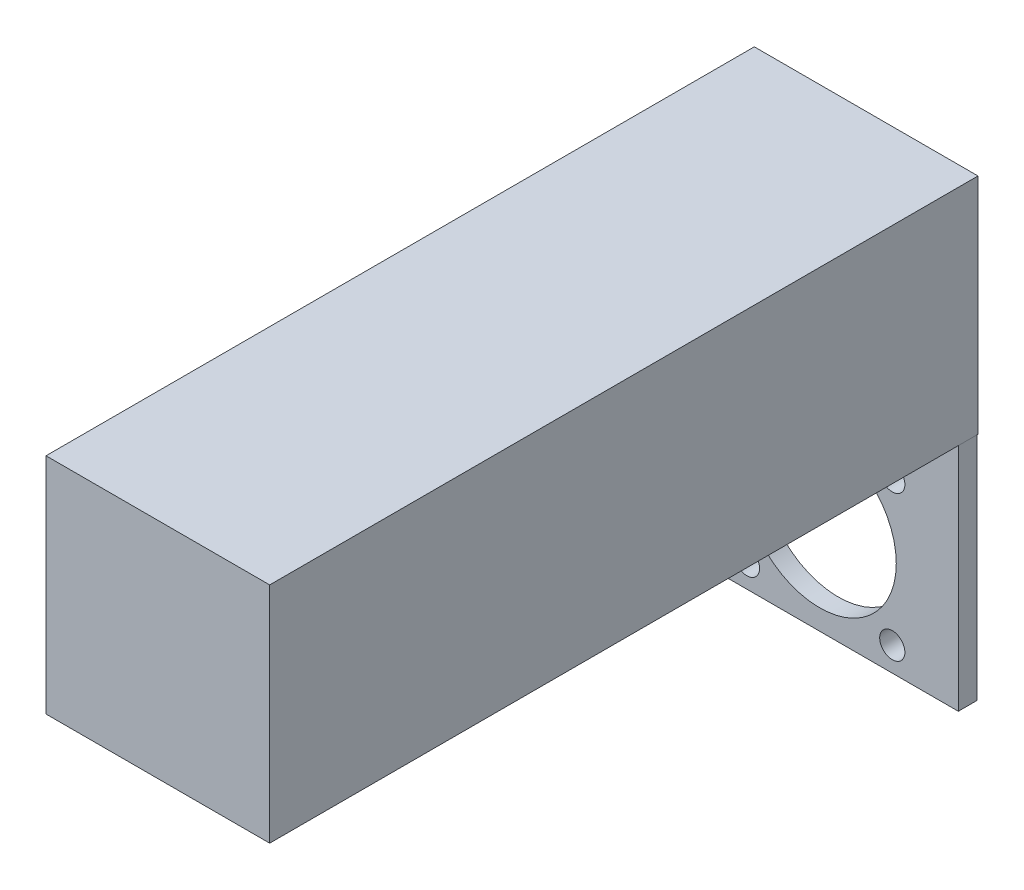
ISO-10303-21;
HEADER;
FILE_DESCRIPTION(('STEP AP214'),'2;1');
FILE_NAME('part.step','',(''),(''),'','','');
FILE_SCHEMA(('AUTOMOTIVE_DESIGN { 1 0 10303 214 1 1 1 1 }'));
ENDSEC;
DATA;
#1=APPLICATION_CONTEXT('core data for automotive mechanical design processes');
#2=APPLICATION_PROTOCOL_DEFINITION('international standard','automotive_design',2000,#1);
#3=PRODUCT_CONTEXT('',#1,'mechanical');
#4=PRODUCT('Part','Part','',(#3));
#5=PRODUCT_RELATED_PRODUCT_CATEGORY('part','',(#4));
#6=PRODUCT_DEFINITION_FORMATION('','',#4);
#7=PRODUCT_DEFINITION_CONTEXT('part definition',#1,'design');
#8=PRODUCT_DEFINITION('design','',#6,#7);
#9=PRODUCT_DEFINITION_SHAPE('','',#8);
#10=(LENGTH_UNIT() NAMED_UNIT(*) SI_UNIT(.MILLI.,.METRE.));
#11=(NAMED_UNIT(*) PLANE_ANGLE_UNIT() SI_UNIT($,.RADIAN.));
#12=(NAMED_UNIT(*) SI_UNIT($,.STERADIAN.) SOLID_ANGLE_UNIT());
#13=UNCERTAINTY_MEASURE_WITH_UNIT(LENGTH_MEASURE(1.E-05),#10,'distance_accuracy_value','');
#14=(GEOMETRIC_REPRESENTATION_CONTEXT(3) GLOBAL_UNCERTAINTY_ASSIGNED_CONTEXT((#13)) GLOBAL_UNIT_ASSIGNED_CONTEXT((#10,
#11,#12)) REPRESENTATION_CONTEXT('',''));
#15=CARTESIAN_POINT('',(0.,0.,0.));
#16=DIRECTION('',(0.,0.,1.));
#17=DIRECTION('',(1.,0.,0.));
#18=AXIS2_PLACEMENT_3D('',#15,#16,#17);
#19=CARTESIAN_POINT('',(0.,39.37,0.));
#20=DIRECTION('',(0.,0.,-1.));
#21=DIRECTION('',(-1.,0.,0.));
#22=AXIS2_PLACEMENT_3D('',#19,#20,#21);
#23=PLANE('',#22);
#24=CARTESIAN_POINT('',(0.,0.,0.));
#25=DIRECTION('',(0.,0.,1.));
#26=DIRECTION('',(1.,0.,0.));
#27=AXIS2_PLACEMENT_3D('',#24,#25,#26);
#28=CIRCLE('',#27,13.0556);
#29=CARTESIAN_POINT('',(13.0556,0.,0.));
#30=VERTEX_POINT('',#29);
#31=EDGE_CURVE('E133',#30,#30,#28,.F.);
#32=ORIENTED_EDGE('',*,*,#31,.T.);
#33=EDGE_LOOP('',(#32));
#34=FACE_BOUND('',#33,.T.);
#35=CARTESIAN_POINT('',(12.3747929348333,12.3747929348333,0.));
#36=DIRECTION('',(0.,0.,1.));
#37=DIRECTION('',(1.,0.,0.));
#38=AXIS2_PLACEMENT_3D('',#35,#36,#37);
#39=CIRCLE('',#38,2.1463);
#40=CARTESIAN_POINT('',(14.5210929348333,12.3747929348333,0.));
#41=VERTEX_POINT('',#40);
#42=EDGE_CURVE('E137',#41,#41,#39,.F.);
#43=ORIENTED_EDGE('',*,*,#42,.T.);
#44=EDGE_LOOP('',(#43));
#45=FACE_BOUND('',#44,.T.);
#46=CARTESIAN_POINT('',(12.3747929348332,-12.3747929348334,0.));
#47=DIRECTION('',(0.,0.,1.));
#48=DIRECTION('',(1.,0.,0.));
#49=AXIS2_PLACEMENT_3D('',#46,#47,#48);
#50=CIRCLE('',#49,2.1463);
#51=CARTESIAN_POINT('',(14.5210929348332,-12.3747929348334,0.));
#52=VERTEX_POINT('',#51);
#53=EDGE_CURVE('E140',#52,#52,#50,.F.);
#54=ORIENTED_EDGE('',*,*,#53,.T.);
#55=EDGE_LOOP('',(#54));
#56=FACE_BOUND('',#55,.T.);
#57=CARTESIAN_POINT('',(-12.3747929348334,-12.3747929348332,0.));
#58=DIRECTION('',(0.,0.,1.));
#59=DIRECTION('',(1.,0.,0.));
#60=AXIS2_PLACEMENT_3D('',#57,#58,#59);
#61=CIRCLE('',#60,2.1463);
#62=CARTESIAN_POINT('',(-10.2284929348334,-12.3747929348332,0.));
#63=VERTEX_POINT('',#62);
#64=EDGE_CURVE('E142',#63,#63,#61,.F.);
#65=ORIENTED_EDGE('',*,*,#64,.T.);
#66=EDGE_LOOP('',(#65));
#67=FACE_BOUND('',#66,.T.);
#68=CARTESIAN_POINT('',(-12.3747929348331,12.3747929348334,0.));
#69=DIRECTION('',(0.,0.,1.));
#70=DIRECTION('',(1.,0.,0.));
#71=AXIS2_PLACEMENT_3D('',#68,#69,#70);
#72=CIRCLE('',#71,2.1463);
#73=CARTESIAN_POINT('',(-10.2284929348331,12.3747929348334,0.));
#74=VERTEX_POINT('',#73);
#75=EDGE_CURVE('E19',#74,#74,#72,.F.);
#76=ORIENTED_EDGE('',*,*,#75,.T.);
#77=EDGE_LOOP('',(#76));
#78=FACE_BOUND('',#77,.T.);
#79=DIRECTION('',(0.,1.,0.));
#80=VECTOR('',#79,1.);
#81=CARTESIAN_POINT('',(23.622,-16.51,0.));
#82=LINE('',#81,#80);
#83=CARTESIAN_POINT('',(23.622,22.86,0.));
#84=VERTEX_POINT('',#83);
#85=CARTESIAN_POINT('',(23.622,-16.51,0.));
#86=VERTEX_POINT('',#85);
#87=EDGE_CURVE('E95',#84,#86,#82,.F.);
#88=ORIENTED_EDGE('',*,*,#87,.F.);
#89=DIRECTION('',(1.,0.,0.));
#90=VECTOR('',#89,1.);
#91=CARTESIAN_POINT('',(23.7998,22.86,0.));
#92=LINE('',#91,#90);
#93=CARTESIAN_POINT('',(-13.97,22.86,0.));
#94=VERTEX_POINT('',#93);
#95=EDGE_CURVE('E183',#94,#84,#92,.T.);
#96=ORIENTED_EDGE('',*,*,#95,.F.);
#97=DIRECTION('',(0.,1.,0.));
#98=VECTOR('',#97,1.);
#99=CARTESIAN_POINT('',(-13.97,19.05,0.));
#100=LINE('',#99,#98);
#101=CARTESIAN_POINT('',(-13.97,19.05,0.));
#102=VERTEX_POINT('',#101);
#103=EDGE_CURVE('E147',#102,#94,#100,.T.);
#104=ORIENTED_EDGE('',*,*,#103,.F.);
#105=DIRECTION('',(-1.,0.,0.));
#106=VECTOR('',#105,1.);
#107=CARTESIAN_POINT('',(-16.51,19.05,0.));
#108=LINE('',#107,#106);
#109=CARTESIAN_POINT('',(-16.51,19.05,0.));
#110=VERTEX_POINT('',#109);
#111=EDGE_CURVE('E155',#110,#102,#108,.F.);
#112=ORIENTED_EDGE('',*,*,#111,.F.);
#113=DIRECTION('',(0.,1.,0.));
#114=VECTOR('',#113,1.);
#115=CARTESIAN_POINT('',(-16.51,0.,0.));
#116=LINE('',#115,#114);
#117=CARTESIAN_POINT('',(-16.51,-16.51,0.));
#118=VERTEX_POINT('',#117);
#119=EDGE_CURVE('E90',#110,#118,#116,.F.);
#120=ORIENTED_EDGE('',*,*,#119,.T.);
#121=DIRECTION('',(1.,0.,0.));
#122=VECTOR('',#121,1.);
#123=CARTESIAN_POINT('',(0.,-16.51,0.));
#124=LINE('',#123,#122);
#125=EDGE_CURVE('E105',#86,#118,#124,.F.);
#126=ORIENTED_EDGE('',*,*,#125,.F.);
#127=EDGE_LOOP('',(#88,#96,#104,#112,#120,#126));
#128=FACE_BOUND('',#127,.T.);
#129=ADVANCED_FACE('F16',(#34,#45,#56,#67,#78,#128),#23,.F.);
#130=CARTESIAN_POINT('',(23.622,-16.51,0.));
#131=DIRECTION('',(1.,0.,0.));
#132=DIRECTION('',(0.,0.,-1.));
#133=AXIS2_PLACEMENT_3D('',#130,#131,#132);
#134=PLANE('',#133);
#135=ORIENTED_EDGE('',*,*,#87,.T.);
#136=DIRECTION('',(0.,0.,1.));
#137=VECTOR('',#136,1.);
#138=CARTESIAN_POINT('',(23.622,-16.51,0.));
#139=LINE('',#138,#137);
#140=CARTESIAN_POINT('',(23.622,-16.51,-3.175));
#141=VERTEX_POINT('',#140);
#142=EDGE_CURVE('E98',#141,#86,#139,.T.);
#143=ORIENTED_EDGE('',*,*,#142,.F.);
#144=DIRECTION('',(0.,1.,0.));
#145=VECTOR('',#144,1.);
#146=CARTESIAN_POINT('',(23.622,39.37,-3.175));
#147=LINE('',#146,#145);
#148=CARTESIAN_POINT('',(23.622,22.86,-3.175));
#149=VERTEX_POINT('',#148);
#150=EDGE_CURVE('E178',#149,#141,#147,.F.);
#151=ORIENTED_EDGE('',*,*,#150,.F.);
#152=DIRECTION('',(0.,0.,-1.));
#153=VECTOR('',#152,1.);
#154=CARTESIAN_POINT('',(23.622,22.86,117.475));
#155=LINE('',#154,#153);
#156=EDGE_CURVE('E101',#84,#149,#155,.T.);
#157=ORIENTED_EDGE('',*,*,#156,.F.);
#158=EDGE_LOOP('',(#135,#143,#151,#157));
#159=FACE_BOUND('',#158,.T.);
#160=ADVANCED_FACE('F96',(#159),#134,.T.);
#161=CARTESIAN_POINT('',(0.,-16.51,0.));
#162=DIRECTION('',(0.,-1.,0.));
#163=DIRECTION('',(1.,0.,0.));
#164=AXIS2_PLACEMENT_3D('',#161,#162,#163);
#165=PLANE('',#164);
#166=ORIENTED_EDGE('',*,*,#125,.T.);
#167=DIRECTION('',(0.,0.,1.));
#168=VECTOR('',#167,1.);
#169=CARTESIAN_POINT('',(-16.51,-16.51,0.));
#170=LINE('',#169,#168);
#171=CARTESIAN_POINT('',(-16.51,-16.51,-3.175));
#172=VERTEX_POINT('',#171);
#173=EDGE_CURVE('E164',#118,#172,#170,.F.);
#174=ORIENTED_EDGE('',*,*,#173,.T.);
#175=DIRECTION('',(-1.,0.,0.));
#176=VECTOR('',#175,1.);
#177=CARTESIAN_POINT('',(0.,-16.51,-3.175));
#178=LINE('',#177,#176);
#179=EDGE_CURVE('E111',#141,#172,#178,.T.);
#180=ORIENTED_EDGE('',*,*,#179,.F.);
#181=ORIENTED_EDGE('',*,*,#142,.T.);
#182=EDGE_LOOP('',(#166,#174,#180,#181));
#183=FACE_BOUND('',#182,.T.);
#184=ADVANCED_FACE('F109',(#183),#165,.T.);
#185=CARTESIAN_POINT('',(-16.51,0.,0.));
#186=DIRECTION('',(1.,0.,0.));
#187=DIRECTION('',(0.,1.,0.));
#188=AXIS2_PLACEMENT_3D('',#185,#186,#187);
#189=PLANE('',#188);
#190=ORIENTED_EDGE('',*,*,#173,.F.);
#191=ORIENTED_EDGE('',*,*,#119,.F.);
#192=DIRECTION('',(0.,0.,1.));
#193=VECTOR('',#192,1.);
#194=CARTESIAN_POINT('',(-16.51,19.05,0.));
#195=LINE('',#194,#193);
#196=CARTESIAN_POINT('',(-16.51,19.05,-3.175));
#197=VERTEX_POINT('',#196);
#198=EDGE_CURVE('E161',#197,#110,#195,.T.);
#199=ORIENTED_EDGE('',*,*,#198,.F.);
#200=DIRECTION('',(0.,1.,0.));
#201=VECTOR('',#200,1.);
#202=CARTESIAN_POINT('',(-16.51,39.37,-3.175));
#203=LINE('',#202,#201);
#204=EDGE_CURVE('E168',#172,#197,#203,.T.);
#205=ORIENTED_EDGE('',*,*,#204,.F.);
#206=EDGE_LOOP('',(#190,#191,#199,#205));
#207=FACE_BOUND('',#206,.T.);
#208=ADVANCED_FACE('F169',(#207),#189,.F.);
#209=CARTESIAN_POINT('',(-16.51,19.05,0.));
#210=DIRECTION('',(0.,1.,0.));
#211=DIRECTION('',(-1.,0.,0.));
#212=AXIS2_PLACEMENT_3D('',#209,#210,#211);
#213=PLANE('',#212);
#214=ORIENTED_EDGE('',*,*,#111,.T.);
#215=DIRECTION('',(0.,0.,1.));
#216=VECTOR('',#215,1.);
#217=CARTESIAN_POINT('',(-13.97,19.05,0.));
#218=LINE('',#217,#216);
#219=CARTESIAN_POINT('',(-13.97,19.05,-3.175));
#220=VERTEX_POINT('',#219);
#221=EDGE_CURVE('E150',#220,#102,#218,.T.);
#222=ORIENTED_EDGE('',*,*,#221,.F.);
#223=DIRECTION('',(-1.,0.,0.));
#224=VECTOR('',#223,1.);
#225=CARTESIAN_POINT('',(0.,19.05,-3.175));
#226=LINE('',#225,#224);
#227=EDGE_CURVE('E173',#197,#220,#226,.F.);
#228=ORIENTED_EDGE('',*,*,#227,.F.);
#229=ORIENTED_EDGE('',*,*,#198,.T.);
#230=EDGE_LOOP('',(#214,#222,#228,#229));
#231=FACE_BOUND('',#230,.T.);
#232=ADVANCED_FACE('F271',(#231),#213,.T.);
#233=CARTESIAN_POINT('',(-13.97,19.05,0.));
#234=DIRECTION('',(-1.,0.,0.));
#235=DIRECTION('',(0.,0.,1.));
#236=AXIS2_PLACEMENT_3D('',#233,#234,#235);
#237=PLANE('',#236);
#238=ORIENTED_EDGE('',*,*,#103,.T.);
#239=DIRECTION('',(0.,0.,-1.));
#240=VECTOR('',#239,1.);
#241=CARTESIAN_POINT('',(-13.97,22.86,117.475));
#242=LINE('',#241,#240);
#243=CARTESIAN_POINT('',(-13.97,22.86,-3.175));
#244=VERTEX_POINT('',#243);
#245=EDGE_CURVE('E136',#244,#94,#242,.F.);
#246=ORIENTED_EDGE('',*,*,#245,.F.);
#247=DIRECTION('',(0.,1.,0.));
#248=VECTOR('',#247,1.);
#249=CARTESIAN_POINT('',(-13.97,39.37,-3.175));
#250=LINE('',#249,#248);
#251=EDGE_CURVE('E193',#220,#244,#250,.T.);
#252=ORIENTED_EDGE('',*,*,#251,.F.);
#253=ORIENTED_EDGE('',*,*,#221,.T.);
#254=EDGE_LOOP('',(#238,#246,#252,#253));
#255=FACE_BOUND('',#254,.T.);
#256=ADVANCED_FACE('F192',(#255),#237,.T.);
#257=CARTESIAN_POINT('',(-12.3747929348331,12.3747929348334,-3.175));
#258=DIRECTION('',(0.,0.,1.));
#259=DIRECTION('',(1.,0.,0.));
#260=AXIS2_PLACEMENT_3D('',#257,#258,#259);
#261=CYLINDRICAL_SURFACE('',#260,2.1463);
#262=ORIENTED_EDGE('',*,*,#75,.F.);
#263=EDGE_LOOP('',(#262));
#264=FACE_BOUND('',#263,.T.);
#265=CARTESIAN_POINT('',(-12.3747929348331,12.3747929348334,-3.175));
#266=DIRECTION('',(0.,0.,1.));
#267=DIRECTION('',(1.,0.,0.));
#268=AXIS2_PLACEMENT_3D('',#265,#266,#267);
#269=CIRCLE('',#268,2.1463);
#270=CARTESIAN_POINT('',(-10.2284929348331,12.3747929348334,-3.175));
#271=VERTEX_POINT('',#270);
#272=EDGE_CURVE('E129',#271,#271,#269,.T.);
#273=ORIENTED_EDGE('',*,*,#272,.F.);
#274=EDGE_LOOP('',(#273));
#275=FACE_BOUND('',#274,.T.);
#276=ADVANCED_FACE('F264',(#264,#275),#261,.F.);
#277=CARTESIAN_POINT('',(-12.3747929348334,-12.3747929348332,-3.175));
#278=DIRECTION('',(0.,0.,1.));
#279=DIRECTION('',(1.,0.,0.));
#280=AXIS2_PLACEMENT_3D('',#277,#278,#279);
#281=CYLINDRICAL_SURFACE('',#280,2.1463);
#282=ORIENTED_EDGE('',*,*,#64,.F.);
#283=EDGE_LOOP('',(#282));
#284=FACE_BOUND('',#283,.T.);
#285=CARTESIAN_POINT('',(-12.3747929348334,-12.3747929348332,-3.175));
#286=DIRECTION('',(0.,0.,1.));
#287=DIRECTION('',(1.,0.,0.));
#288=AXIS2_PLACEMENT_3D('',#285,#286,#287);
#289=CIRCLE('',#288,2.1463);
#290=CARTESIAN_POINT('',(-10.2284929348334,-12.3747929348332,-3.175));
#291=VERTEX_POINT('',#290);
#292=EDGE_CURVE('E126',#291,#291,#289,.T.);
#293=ORIENTED_EDGE('',*,*,#292,.F.);
#294=EDGE_LOOP('',(#293));
#295=FACE_BOUND('',#294,.T.);
#296=ADVANCED_FACE('F260',(#284,#295),#281,.F.);
#297=CARTESIAN_POINT('',(12.3747929348332,-12.3747929348334,-3.175));
#298=DIRECTION('',(0.,0.,1.));
#299=DIRECTION('',(1.,0.,0.));
#300=AXIS2_PLACEMENT_3D('',#297,#298,#299);
#301=CYLINDRICAL_SURFACE('',#300,2.1463);
#302=ORIENTED_EDGE('',*,*,#53,.F.);
#303=EDGE_LOOP('',(#302));
#304=FACE_BOUND('',#303,.T.);
#305=CARTESIAN_POINT('',(12.3747929348332,-12.3747929348334,-3.175));
#306=DIRECTION('',(0.,0.,1.));
#307=DIRECTION('',(1.,0.,0.));
#308=AXIS2_PLACEMENT_3D('',#305,#306,#307);
#309=CIRCLE('',#308,2.1463);
#310=CARTESIAN_POINT('',(14.5210929348332,-12.3747929348334,-3.175));
#311=VERTEX_POINT('',#310);
#312=EDGE_CURVE('E123',#311,#311,#309,.T.);
#313=ORIENTED_EDGE('',*,*,#312,.F.);
#314=EDGE_LOOP('',(#313));
#315=FACE_BOUND('',#314,.T.);
#316=ADVANCED_FACE('F256',(#304,#315),#301,.F.);
#317=CARTESIAN_POINT('',(12.3747929348333,12.3747929348333,-3.175));
#318=DIRECTION('',(0.,0.,1.));
#319=DIRECTION('',(1.,0.,0.));
#320=AXIS2_PLACEMENT_3D('',#317,#318,#319);
#321=CYLINDRICAL_SURFACE('',#320,2.1463);
#322=ORIENTED_EDGE('',*,*,#42,.F.);
#323=EDGE_LOOP('',(#322));
#324=FACE_BOUND('',#323,.T.);
#325=CARTESIAN_POINT('',(12.3747929348333,12.3747929348333,-3.175));
#326=DIRECTION('',(0.,0.,1.));
#327=DIRECTION('',(1.,0.,0.));
#328=AXIS2_PLACEMENT_3D('',#325,#326,#327);
#329=CIRCLE('',#328,2.1463);
#330=CARTESIAN_POINT('',(14.5210929348333,12.3747929348333,-3.175));
#331=VERTEX_POINT('',#330);
#332=EDGE_CURVE('E120',#331,#331,#329,.T.);
#333=ORIENTED_EDGE('',*,*,#332,.F.);
#334=EDGE_LOOP('',(#333));
#335=FACE_BOUND('',#334,.T.);
#336=ADVANCED_FACE('F252',(#324,#335),#321,.F.);
#337=CARTESIAN_POINT('',(0.,0.,-3.175));
#338=DIRECTION('',(0.,0.,1.));
#339=DIRECTION('',(1.,0.,0.));
#340=AXIS2_PLACEMENT_3D('',#337,#338,#339);
#341=CYLINDRICAL_SURFACE('',#340,13.0556);
#342=ORIENTED_EDGE('',*,*,#31,.F.);
#343=EDGE_LOOP('',(#342));
#344=FACE_BOUND('',#343,.T.);
#345=CARTESIAN_POINT('',(0.,0.,-3.175));
#346=DIRECTION('',(0.,0.,1.));
#347=DIRECTION('',(1.,0.,0.));
#348=AXIS2_PLACEMENT_3D('',#345,#346,#347);
#349=CIRCLE('',#348,13.0556);
#350=CARTESIAN_POINT('',(13.0556,0.,-3.175));
#351=VERTEX_POINT('',#350);
#352=EDGE_CURVE('E116',#351,#351,#349,.T.);
#353=ORIENTED_EDGE('',*,*,#352,.F.);
#354=EDGE_LOOP('',(#353));
#355=FACE_BOUND('',#354,.T.);
#356=ADVANCED_FACE('F249',(#344,#355),#341,.F.);
#357=CARTESIAN_POINT('',(23.7998,22.86,117.475));
#358=DIRECTION('',(0.,-1.,0.));
#359=DIRECTION('',(0.,0.,-1.));
#360=AXIS2_PLACEMENT_3D('',#357,#358,#359);
#361=PLANE('',#360);
#362=DIRECTION('',(0.,0.,1.));
#363=VECTOR('',#362,1.);
#364=CARTESIAN_POINT('',(-14.3002,22.86,117.475));
#365=LINE('',#364,#363);
#366=CARTESIAN_POINT('',(-14.3002,22.86,-3.175));
#367=VERTEX_POINT('',#366);
#368=CARTESIAN_POINT('',(-14.3002,22.86,117.475));
#369=VERTEX_POINT('',#368);
#370=EDGE_CURVE('E201',#367,#369,#365,.T.);
#371=ORIENTED_EDGE('',*,*,#370,.F.);
#372=DIRECTION('',(-1.,0.,0.));
#373=VECTOR('',#372,1.);
#374=CARTESIAN_POINT('',(0.,22.86,-3.175));
#375=LINE('',#374,#373);
#376=EDGE_CURVE('E189',#244,#367,#375,.T.);
#377=ORIENTED_EDGE('',*,*,#376,.F.);
#378=ORIENTED_EDGE('',*,*,#245,.T.);
#379=ORIENTED_EDGE('',*,*,#95,.T.);
#380=ORIENTED_EDGE('',*,*,#156,.T.);
#381=DIRECTION('',(-1.,0.,0.));
#382=VECTOR('',#381,1.);
#383=CARTESIAN_POINT('',(0.,22.86,-3.175));
#384=LINE('',#383,#382);
#385=CARTESIAN_POINT('',(23.7998,22.86,-3.175));
#386=VERTEX_POINT('',#385);
#387=EDGE_CURVE('E132',#386,#149,#384,.T.);
#388=ORIENTED_EDGE('',*,*,#387,.F.);
#389=DIRECTION('',(0.,0.,-1.));
#390=VECTOR('',#389,1.);
#391=CARTESIAN_POINT('',(23.7998,22.86,117.475));
#392=LINE('',#391,#390);
#393=CARTESIAN_POINT('',(23.7998,22.86,117.475));
#394=VERTEX_POINT('',#393);
#395=EDGE_CURVE('E212',#394,#386,#392,.T.);
#396=ORIENTED_EDGE('',*,*,#395,.F.);
#397=DIRECTION('',(1.,0.,0.));
#398=VECTOR('',#397,1.);
#399=CARTESIAN_POINT('',(0.,22.86,117.475));
#400=LINE('',#399,#398);
#401=EDGE_CURVE('E206',#369,#394,#400,.T.);
#402=ORIENTED_EDGE('',*,*,#401,.F.);
#403=EDGE_LOOP('',(#371,#377,#378,#379,#380,#388,#396,#402));
#404=FACE_BOUND('',#403,.T.);
#405=ADVANCED_FACE('F188',(#404),#361,.T.);
#406=CARTESIAN_POINT('',(0.,39.37,-3.175));
#407=DIRECTION('',(0.,0.,-1.));
#408=DIRECTION('',(-1.,0.,0.));
#409=AXIS2_PLACEMENT_3D('',#406,#407,#408);
#410=PLANE('',#409);
#411=ORIENTED_EDGE('',*,*,#352,.T.);
#412=EDGE_LOOP('',(#411));
#413=FACE_BOUND('',#412,.T.);
#414=ORIENTED_EDGE('',*,*,#332,.T.);
#415=EDGE_LOOP('',(#414));
#416=FACE_BOUND('',#415,.T.);
#417=ORIENTED_EDGE('',*,*,#312,.T.);
#418=EDGE_LOOP('',(#417));
#419=FACE_BOUND('',#418,.T.);
#420=ORIENTED_EDGE('',*,*,#292,.T.);
#421=EDGE_LOOP('',(#420));
#422=FACE_BOUND('',#421,.T.);
#423=ORIENTED_EDGE('',*,*,#272,.T.);
#424=EDGE_LOOP('',(#423));
#425=FACE_BOUND('',#424,.T.);
#426=DIRECTION('',(0.,1.,0.));
#427=VECTOR('',#426,1.);
#428=CARTESIAN_POINT('',(23.7998,22.86,-3.175));
#429=LINE('',#428,#427);
#430=CARTESIAN_POINT('',(23.7998,60.96,-3.175));
#431=VERTEX_POINT('',#430);
#432=EDGE_CURVE('E208',#386,#431,#429,.T.);
#433=ORIENTED_EDGE('',*,*,#432,.F.);
#434=ORIENTED_EDGE('',*,*,#387,.T.);
#435=ORIENTED_EDGE('',*,*,#150,.T.);
#436=ORIENTED_EDGE('',*,*,#179,.T.);
#437=ORIENTED_EDGE('',*,*,#204,.T.);
#438=ORIENTED_EDGE('',*,*,#227,.T.);
#439=ORIENTED_EDGE('',*,*,#251,.T.);
#440=ORIENTED_EDGE('',*,*,#376,.T.);
#441=DIRECTION('',(0.,1.,0.));
#442=VECTOR('',#441,1.);
#443=CARTESIAN_POINT('',(-14.3002,22.86,-3.175));
#444=LINE('',#443,#442);
#445=CARTESIAN_POINT('',(-14.3002,60.96,-3.175));
#446=VERTEX_POINT('',#445);
#447=EDGE_CURVE('E119',#446,#367,#444,.F.);
#448=ORIENTED_EDGE('',*,*,#447,.F.);
#449=DIRECTION('',(-1.,0.,0.));
#450=VECTOR('',#449,1.);
#451=CARTESIAN_POINT('',(23.7998,60.96,-3.175));
#452=LINE('',#451,#450);
#453=EDGE_CURVE('E215',#431,#446,#452,.T.);
#454=ORIENTED_EDGE('',*,*,#453,.F.);
#455=EDGE_LOOP('',(#433,#434,#435,#436,#437,#438,#439,#440,#448,#454));
#456=FACE_BOUND('',#455,.T.);
#457=ADVANCED_FACE('F176',(#413,#416,#419,#422,#425,#456),#410,.T.);
#458=CARTESIAN_POINT('',(-14.3002,22.86,117.475));
#459=DIRECTION('',(-1.,0.,0.));
#460=DIRECTION('',(0.,0.,1.));
#461=AXIS2_PLACEMENT_3D('',#458,#459,#460);
#462=PLANE('',#461);
#463=DIRECTION('',(0.,1.,0.));
#464=VECTOR('',#463,1.);
#465=CARTESIAN_POINT('',(-14.3002,0.,117.475));
#466=LINE('',#465,#464);
#467=CARTESIAN_POINT('',(-14.3002,60.96,117.475));
#468=VERTEX_POINT('',#467);
#469=EDGE_CURVE('E203',#468,#369,#466,.F.);
#470=ORIENTED_EDGE('',*,*,#469,.F.);
#471=DIRECTION('',(0.,0.,1.));
#472=VECTOR('',#471,1.);
#473=CARTESIAN_POINT('',(-14.3002,60.96,117.475));
#474=LINE('',#473,#472);
#475=EDGE_CURVE('E218',#446,#468,#474,.T.);
#476=ORIENTED_EDGE('',*,*,#475,.F.);
#477=ORIENTED_EDGE('',*,*,#447,.T.);
#478=ORIENTED_EDGE('',*,*,#370,.T.);
#479=EDGE_LOOP('',(#470,#476,#477,#478));
#480=FACE_BOUND('',#479,.T.);
#481=ADVANCED_FACE('F229',(#480),#462,.T.);
#482=CARTESIAN_POINT('',(0.,0.,117.475));
#483=DIRECTION('',(0.,0.,1.));
#484=DIRECTION('',(1.,0.,0.));
#485=AXIS2_PLACEMENT_3D('',#482,#483,#484);
#486=PLANE('',#485);
#487=ORIENTED_EDGE('',*,*,#469,.T.);
#488=ORIENTED_EDGE('',*,*,#401,.T.);
#489=DIRECTION('',(0.,1.,0.));
#490=VECTOR('',#489,1.);
#491=CARTESIAN_POINT('',(23.7998,22.86,117.475));
#492=LINE('',#491,#490);
#493=CARTESIAN_POINT('',(23.7998,60.96,117.475));
#494=VERTEX_POINT('',#493);
#495=EDGE_CURVE('E34',#494,#394,#492,.F.);
#496=ORIENTED_EDGE('',*,*,#495,.F.);
#497=DIRECTION('',(-1.,0.,0.));
#498=VECTOR('',#497,1.);
#499=CARTESIAN_POINT('',(23.7998,60.96,117.475));
#500=LINE('',#499,#498);
#501=EDGE_CURVE('E25',#468,#494,#500,.F.);
#502=ORIENTED_EDGE('',*,*,#501,.F.);
#503=EDGE_LOOP('',(#487,#488,#496,#502));
#504=FACE_BOUND('',#503,.T.);
#505=ADVANCED_FACE('F225',(#504),#486,.T.);
#506=CARTESIAN_POINT('',(23.7998,22.86,117.475));
#507=DIRECTION('',(1.,0.,0.));
#508=DIRECTION('',(0.,0.,-1.));
#509=AXIS2_PLACEMENT_3D('',#506,#507,#508);
#510=PLANE('',#509);
#511=ORIENTED_EDGE('',*,*,#495,.T.);
#512=ORIENTED_EDGE('',*,*,#395,.T.);
#513=ORIENTED_EDGE('',*,*,#432,.T.);
#514=DIRECTION('',(0.,0.,1.));
#515=VECTOR('',#514,1.);
#516=CARTESIAN_POINT('',(23.7998,60.96,117.475));
#517=LINE('',#516,#515);
#518=EDGE_CURVE('E11',#494,#431,#517,.F.);
#519=ORIENTED_EDGE('',*,*,#518,.F.);
#520=EDGE_LOOP('',(#511,#512,#513,#519));
#521=FACE_BOUND('',#520,.T.);
#522=ADVANCED_FACE('F231',(#521),#510,.T.);
#523=CARTESIAN_POINT('',(23.7998,60.96,117.475));
#524=DIRECTION('',(0.,1.,0.));
#525=DIRECTION('',(-1.,0.,0.));
#526=AXIS2_PLACEMENT_3D('',#523,#524,#525);
#527=PLANE('',#526);
#528=ORIENTED_EDGE('',*,*,#501,.T.);
#529=ORIENTED_EDGE('',*,*,#518,.T.);
#530=ORIENTED_EDGE('',*,*,#453,.T.);
#531=ORIENTED_EDGE('',*,*,#475,.T.);
#532=EDGE_LOOP('',(#528,#529,#530,#531));
#533=FACE_BOUND('',#532,.T.);
#534=ADVANCED_FACE('F223',(#533),#527,.T.);
#535=CLOSED_SHELL('',(#129,#160,#184,#208,#232,#256,#276,#296,#316,#336,#356,#405,#457,#481,
#505,#522,#534));
#536=MANIFOLD_SOLID_BREP('B1',#535);
#537=ADVANCED_BREP_SHAPE_REPRESENTATION('',(#18,#536),#14);
#538=SHAPE_DEFINITION_REPRESENTATION(#9,#537);
ENDSEC;
END-ISO-10303-21;
